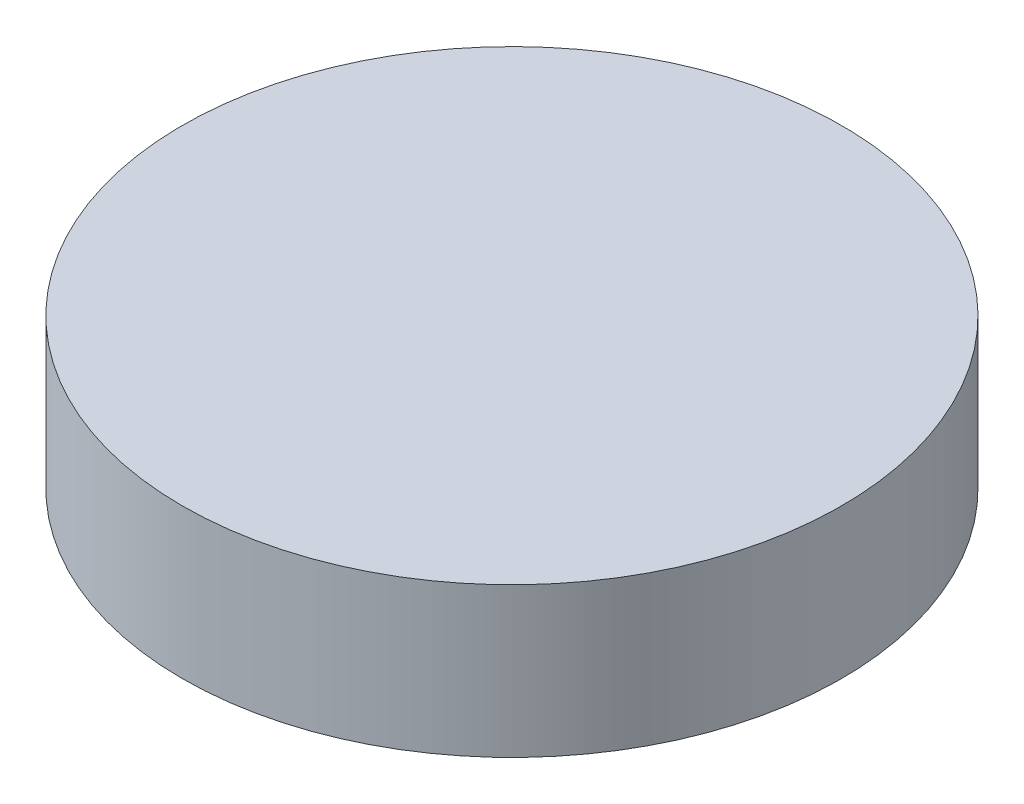
ISO-10303-21;
HEADER;
FILE_DESCRIPTION(('STEP AP214'),'2;1');
FILE_NAME('part.step','',(''),(''),'','','');
FILE_SCHEMA(('AUTOMOTIVE_DESIGN { 1 0 10303 214 1 1 1 1 }'));
ENDSEC;
DATA;
#1=APPLICATION_CONTEXT('core data for automotive mechanical design processes');
#2=APPLICATION_PROTOCOL_DEFINITION('international standard','automotive_design',2000,#1);
#3=PRODUCT_CONTEXT('',#1,'mechanical');
#4=PRODUCT('Part','Part','',(#3));
#5=PRODUCT_RELATED_PRODUCT_CATEGORY('part','',(#4));
#6=PRODUCT_DEFINITION_FORMATION('','',#4);
#7=PRODUCT_DEFINITION_CONTEXT('part definition',#1,'design');
#8=PRODUCT_DEFINITION('design','',#6,#7);
#9=PRODUCT_DEFINITION_SHAPE('','',#8);
#10=(LENGTH_UNIT() NAMED_UNIT(*) SI_UNIT(.MILLI.,.METRE.));
#11=(NAMED_UNIT(*) PLANE_ANGLE_UNIT() SI_UNIT($,.RADIAN.));
#12=(NAMED_UNIT(*) SI_UNIT($,.STERADIAN.) SOLID_ANGLE_UNIT());
#13=UNCERTAINTY_MEASURE_WITH_UNIT(LENGTH_MEASURE(1.E-05),#10,'distance_accuracy_value','');
#14=(GEOMETRIC_REPRESENTATION_CONTEXT(3) GLOBAL_UNCERTAINTY_ASSIGNED_CONTEXT((#13)) GLOBAL_UNIT_ASSIGNED_CONTEXT((#10,
#11,#12)) REPRESENTATION_CONTEXT('',''));
#15=CARTESIAN_POINT('',(0.,0.,0.));
#16=DIRECTION('',(0.,0.,1.));
#17=DIRECTION('',(1.,0.,0.));
#18=AXIS2_PLACEMENT_3D('',#15,#16,#17);
#19=CARTESIAN_POINT('',(0.,25.4,0.));
#20=DIRECTION('',(0.,-1.,0.));
#21=DIRECTION('',(0.,0.,-1.));
#22=AXIS2_PLACEMENT_3D('',#19,#20,#21);
#23=CYLINDRICAL_SURFACE('',#22,55.959375);
#24=CARTESIAN_POINT('',(0.,25.4,0.));
#25=DIRECTION('',(0.,1.,0.));
#26=DIRECTION('',(0.,0.,1.));
#27=AXIS2_PLACEMENT_3D('',#24,#25,#26);
#28=CIRCLE('',#27,55.959375);
#29=CARTESIAN_POINT('',(0.,25.4,55.959375));
#30=VERTEX_POINT('',#29);
#31=EDGE_CURVE('E10',#30,#30,#28,.T.);
#32=ORIENTED_EDGE('',*,*,#31,.F.);
#33=EDGE_LOOP('',(#32));
#34=FACE_BOUND('',#33,.T.);
#35=CARTESIAN_POINT('',(0.,0.,0.));
#36=DIRECTION('',(0.,1.,0.));
#37=DIRECTION('',(0.,0.,1.));
#38=AXIS2_PLACEMENT_3D('',#35,#36,#37);
#39=CIRCLE('',#38,55.959375);
#40=CARTESIAN_POINT('',(0.,0.,55.959375));
#41=VERTEX_POINT('',#40);
#42=EDGE_CURVE('E34',#41,#41,#39,.T.);
#43=ORIENTED_EDGE('',*,*,#42,.T.);
#44=EDGE_LOOP('',(#43));
#45=FACE_BOUND('',#44,.T.);
#46=ADVANCED_FACE('F31',(#34,#45),#23,.T.);
#47=CARTESIAN_POINT('',(0.,25.4,0.));
#48=DIRECTION('',(0.,1.,0.));
#49=DIRECTION('',(0.,0.,1.));
#50=AXIS2_PLACEMENT_3D('',#47,#48,#49);
#51=PLANE('',#50);
#52=ORIENTED_EDGE('',*,*,#31,.T.);
#53=EDGE_LOOP('',(#52));
#54=FACE_BOUND('',#53,.T.);
#55=ADVANCED_FACE('F46',(#54),#51,.T.);
#56=CARTESIAN_POINT('',(0.,0.,0.));
#57=DIRECTION('',(0.,1.,0.));
#58=DIRECTION('',(0.,0.,1.));
#59=AXIS2_PLACEMENT_3D('',#56,#57,#58);
#60=PLANE('',#59);
#61=ORIENTED_EDGE('',*,*,#42,.F.);
#62=EDGE_LOOP('',(#61));
#63=FACE_BOUND('',#62,.T.);
#64=ADVANCED_FACE('F44',(#63),#60,.F.);
#65=CLOSED_SHELL('',(#46,#55,#64));
#66=MANIFOLD_SOLID_BREP('B2',#65);
#67=ADVANCED_BREP_SHAPE_REPRESENTATION('',(#18,#66),#14);
#68=SHAPE_DEFINITION_REPRESENTATION(#9,#67);
ENDSEC;
END-ISO-10303-21;
